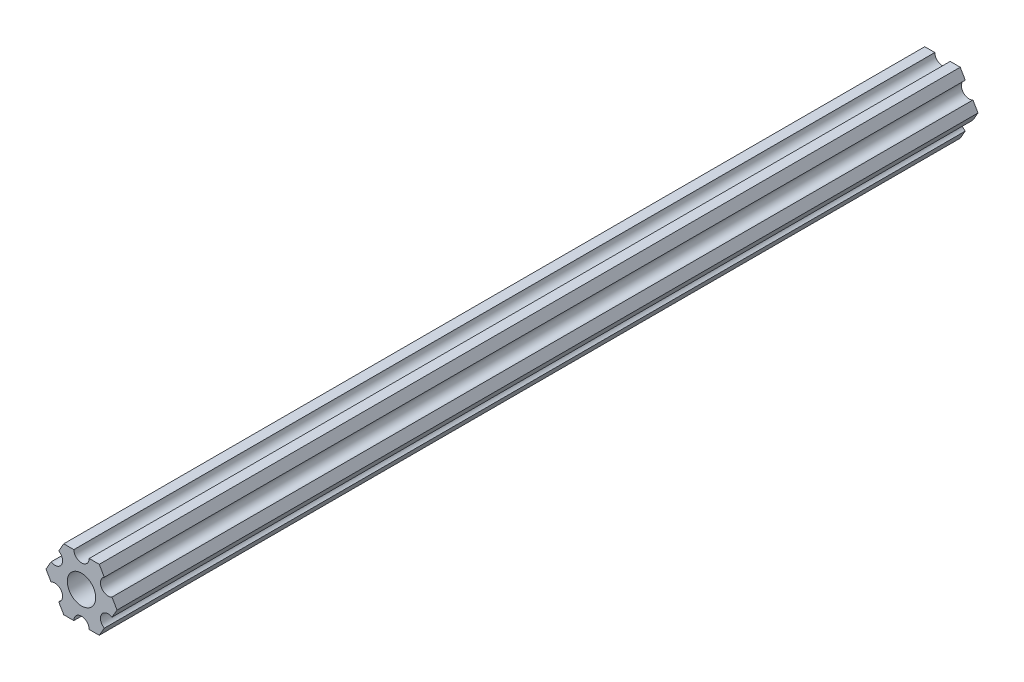
ISO-10303-21;
HEADER;
FILE_DESCRIPTION(('STEP AP214'),'2;1');
FILE_NAME('part.step','',(''),(''),'','','');
FILE_SCHEMA(('AUTOMOTIVE_DESIGN { 1 0 10303 214 1 1 1 1 }'));
ENDSEC;
DATA;
#1=APPLICATION_CONTEXT('core data for automotive mechanical design processes');
#2=APPLICATION_PROTOCOL_DEFINITION('international standard','automotive_design',2000,#1);
#3=PRODUCT_CONTEXT('',#1,'mechanical');
#4=PRODUCT('Part','Part','',(#3));
#5=PRODUCT_RELATED_PRODUCT_CATEGORY('part','',(#4));
#6=PRODUCT_DEFINITION_FORMATION('','',#4);
#7=PRODUCT_DEFINITION_CONTEXT('part definition',#1,'design');
#8=PRODUCT_DEFINITION('design','',#6,#7);
#9=PRODUCT_DEFINITION_SHAPE('','',#8);
#10=(LENGTH_UNIT() NAMED_UNIT(*) SI_UNIT(.MILLI.,.METRE.));
#11=(NAMED_UNIT(*) PLANE_ANGLE_UNIT() SI_UNIT($,.RADIAN.));
#12=(NAMED_UNIT(*) SI_UNIT($,.STERADIAN.) SOLID_ANGLE_UNIT());
#13=UNCERTAINTY_MEASURE_WITH_UNIT(LENGTH_MEASURE(1.E-05),#10,'distance_accuracy_value','');
#14=(GEOMETRIC_REPRESENTATION_CONTEXT(3) GLOBAL_UNCERTAINTY_ASSIGNED_CONTEXT((#13)) GLOBAL_UNIT_ASSIGNED_CONTEXT((#10,
#11,#12)) REPRESENTATION_CONTEXT('',''));
#15=CARTESIAN_POINT('',(0.,0.,0.));
#16=DIRECTION('',(0.,0.,1.));
#17=DIRECTION('',(1.,0.,0.));
#18=AXIS2_PLACEMENT_3D('',#15,#16,#17);
#19=CARTESIAN_POINT('',(5.49926131403118,3.175,177.8));
#20=DIRECTION('',(0.,0.,1.));
#21=DIRECTION('',(1.,0.,0.));
#22=AXIS2_PLACEMENT_3D('',#19,#20,#21);
#23=PLANE('',#22);
#24=DIRECTION('',(0.499999999999995,0.866025403784441,0.));
#25=VECTOR('',#24,1.);
#26=CARTESIAN_POINT('',(6.29301131403117,-1.8001846714922,177.8));
#27=LINE('',#26,#25);
#28=CARTESIAN_POINT('',(6.29301131403117,-1.8001846714922,177.8));
#29=VERTEX_POINT('',#28);
#30=CARTESIAN_POINT('',(7.33234841870821,0.,177.8));
#31=VERTEX_POINT('',#30);
#32=EDGE_CURVE('E231',#29,#31,#27,.T.);
#33=ORIENTED_EDGE('',*,*,#32,.T.);
#34=DIRECTION('',(-0.500000000000001,0.866025403784438,0.));
#35=VECTOR('',#34,1.);
#36=CARTESIAN_POINT('',(7.33234841870821,0.,177.8));
#37=LINE('',#36,#35);
#38=CARTESIAN_POINT('',(6.29301131403114,1.80018467149222,177.8));
#39=VERTEX_POINT('',#38);
#40=EDGE_CURVE('E129',#31,#39,#37,.T.);
#41=ORIENTED_EDGE('',*,*,#40,.T.);
#42=CARTESIAN_POINT('',(5.49926131403118,3.175,177.8));
#43=DIRECTION('',(0.,0.,-1.));
#44=DIRECTION('',(1.,0.,0.));
#45=AXIS2_PLACEMENT_3D('',#42,#43,#44);
#46=CIRCLE('',#45,1.58749999999997);
#47=CARTESIAN_POINT('',(4.70551131403117,4.54981532850775,177.8));
#48=VERTEX_POINT('',#47);
#49=EDGE_CURVE('E276',#39,#48,#46,.T.);
#50=ORIENTED_EDGE('',*,*,#49,.T.);
#51=DIRECTION('',(-0.500000000000001,0.866025403784438,0.));
#52=VECTOR('',#51,1.);
#53=CARTESIAN_POINT('',(4.70551131403117,4.54981532850775,177.8));
#54=LINE('',#53,#52);
#55=CARTESIAN_POINT('',(3.66617420935409,6.34999999999998,177.8));
#56=VERTEX_POINT('',#55);
#57=EDGE_CURVE('E295',#48,#56,#54,.T.);
#58=ORIENTED_EDGE('',*,*,#57,.T.);
#59=DIRECTION('',(-1.,0.,0.));
#60=VECTOR('',#59,1.);
#61=CARTESIAN_POINT('',(3.66617420935409,6.34999999999998,177.8));
#62=LINE('',#61,#60);
#63=CARTESIAN_POINT('',(1.58749999999997,6.34999999999997,177.8));
#64=VERTEX_POINT('',#63);
#65=EDGE_CURVE('E292',#56,#64,#62,.T.);
#66=ORIENTED_EDGE('',*,*,#65,.T.);
#67=CARTESIAN_POINT('',(0.,6.35,177.8));
#68=DIRECTION('',(0.,0.,-1.));
#69=DIRECTION('',(1.,0.,0.));
#70=AXIS2_PLACEMENT_3D('',#67,#68,#69);
#71=CIRCLE('',#70,1.5875);
#72=CARTESIAN_POINT('',(-1.5875,6.34999999999996,177.8));
#73=VERTEX_POINT('',#72);
#74=EDGE_CURVE('E294',#64,#73,#71,.T.);
#75=ORIENTED_EDGE('',*,*,#74,.T.);
#76=DIRECTION('',(-1.,0.,0.));
#77=VECTOR('',#76,1.);
#78=CARTESIAN_POINT('',(-1.58750000000003,6.34999999999996,177.8));
#79=LINE('',#78,#77);
#80=CARTESIAN_POINT('',(-3.66617420935413,6.34999999999995,177.8));
#81=VERTEX_POINT('',#80);
#82=EDGE_CURVE('E297',#73,#81,#79,.T.);
#83=ORIENTED_EDGE('',*,*,#82,.T.);
#84=DIRECTION('',(-0.499999999999995,-0.866025403784442,0.));
#85=VECTOR('',#84,1.);
#86=CARTESIAN_POINT('',(-3.66617420935413,6.34999999999995,177.8));
#87=LINE('',#86,#85);
#88=CARTESIAN_POINT('',(-4.70551131403113,4.54981532850783,177.8));
#89=VERTEX_POINT('',#88);
#90=EDGE_CURVE('E303',#81,#89,#87,.T.);
#91=ORIENTED_EDGE('',*,*,#90,.T.);
#92=CARTESIAN_POINT('',(-5.49926131403119,3.175,177.8));
#93=DIRECTION('',(0.,0.,-1.));
#94=DIRECTION('',(1.,0.,0.));
#95=AXIS2_PLACEMENT_3D('',#92,#93,#94);
#96=CIRCLE('',#95,1.5875);
#97=CARTESIAN_POINT('',(-6.29301131403115,1.80018467149218,177.8));
#98=VERTEX_POINT('',#97);
#99=EDGE_CURVE('E305',#89,#98,#96,.T.);
#100=ORIENTED_EDGE('',*,*,#99,.T.);
#101=DIRECTION('',(-0.499999999999995,-0.866025403784442,0.));
#102=VECTOR('',#101,1.);
#103=CARTESIAN_POINT('',(-6.29301131403112,1.80018467149222,177.8));
#104=LINE('',#103,#102);
#105=CARTESIAN_POINT('',(-7.33234841870821,0.,177.8));
#106=VERTEX_POINT('',#105);
#107=EDGE_CURVE('E307',#98,#106,#104,.T.);
#108=ORIENTED_EDGE('',*,*,#107,.T.);
#109=DIRECTION('',(0.500000000000007,-0.866025403784435,0.));
#110=VECTOR('',#109,1.);
#111=CARTESIAN_POINT('',(-7.33234841870821,0.,177.8));
#112=LINE('',#111,#110);
#113=CARTESIAN_POINT('',(-6.29301131403118,-1.80018467149216,177.8));
#114=VERTEX_POINT('',#113);
#115=EDGE_CURVE('E309',#106,#114,#112,.T.);
#116=ORIENTED_EDGE('',*,*,#115,.T.);
#117=CARTESIAN_POINT('',(-5.49926131403118,-3.175,177.8));
#118=DIRECTION('',(0.,0.,-1.));
#119=DIRECTION('',(1.,0.,0.));
#120=AXIS2_PLACEMENT_3D('',#117,#118,#119);
#121=CIRCLE('',#120,1.5875);
#122=CARTESIAN_POINT('',(-4.70551131403114,-4.54981532850777,177.8));
#123=VERTEX_POINT('',#122);
#124=EDGE_CURVE('E311',#114,#123,#121,.T.);
#125=ORIENTED_EDGE('',*,*,#124,.T.);
#126=DIRECTION('',(0.500000000000007,-0.866025403784435,0.));
#127=VECTOR('',#126,1.);
#128=CARTESIAN_POINT('',(-4.70551131403116,-4.54981532850774,177.8));
#129=LINE('',#128,#127);
#130=CARTESIAN_POINT('',(-3.66617420935405,-6.35,177.8));
#131=VERTEX_POINT('',#130);
#132=EDGE_CURVE('E313',#123,#131,#129,.T.);
#133=ORIENTED_EDGE('',*,*,#132,.T.);
#134=DIRECTION('',(1.,0.,0.));
#135=VECTOR('',#134,1.);
#136=CARTESIAN_POINT('',(-3.66617420935405,-6.35,177.8));
#137=LINE('',#136,#135);
#138=CARTESIAN_POINT('',(-1.58750000000002,-6.34999999999998,177.8));
#139=VERTEX_POINT('',#138);
#140=EDGE_CURVE('E315',#131,#139,#137,.T.);
#141=ORIENTED_EDGE('',*,*,#140,.T.);
#142=CARTESIAN_POINT('',(0.,-6.34999999999996,177.8));
#143=DIRECTION('',(0.,0.,-1.));
#144=DIRECTION('',(1.,0.,0.));
#145=AXIS2_PLACEMENT_3D('',#142,#143,#144);
#146=CIRCLE('',#145,1.5875);
#147=CARTESIAN_POINT('',(1.58749999999998,-6.34999999999995,177.8));
#148=VERTEX_POINT('',#147);
#149=EDGE_CURVE('E178',#139,#148,#146,.T.);
#150=ORIENTED_EDGE('',*,*,#149,.T.);
#151=DIRECTION('',(1.,0.,0.));
#152=VECTOR('',#151,1.);
#153=CARTESIAN_POINT('',(1.58749999999998,-6.34999999999995,177.8));
#154=LINE('',#153,#152);
#155=CARTESIAN_POINT('',(3.66617420935418,-6.34999999999992,177.8));
#156=VERTEX_POINT('',#155);
#157=EDGE_CURVE('E172',#148,#156,#154,.T.);
#158=ORIENTED_EDGE('',*,*,#157,.T.);
#159=DIRECTION('',(0.499999999999995,0.866025403784442,0.));
#160=VECTOR('',#159,1.);
#161=CARTESIAN_POINT('',(3.66617420935418,-6.34999999999992,177.8));
#162=LINE('',#161,#160);
#163=CARTESIAN_POINT('',(4.70551131403118,-4.5498153285078,177.8));
#164=VERTEX_POINT('',#163);
#165=EDGE_CURVE('E176',#156,#164,#162,.T.);
#166=ORIENTED_EDGE('',*,*,#165,.T.);
#167=CARTESIAN_POINT('',(5.49926131403115,-3.17499999999999,177.8));
#168=DIRECTION('',(0.,0.,-1.));
#169=DIRECTION('',(1.,0.,0.));
#170=AXIS2_PLACEMENT_3D('',#167,#168,#169);
#171=CIRCLE('',#170,1.5875);
#172=EDGE_CURVE('E56',#164,#29,#171,.T.);
#173=ORIENTED_EDGE('',*,*,#172,.T.);
#174=EDGE_LOOP('',(#33,#41,#50,#58,#66,#75,#83,#91,#100,#108,#116,#125,#133,#141,#150,#158,#166,#173));
#175=FACE_BOUND('',#174,.T.);
#176=CARTESIAN_POINT('',(0.,0.,177.8));
#177=DIRECTION('',(0.,0.,1.));
#178=DIRECTION('',(1.,0.,0.));
#179=AXIS2_PLACEMENT_3D('',#176,#177,#178);
#180=CIRCLE('',#179,2.9337);
#181=CARTESIAN_POINT('',(2.9337,0.,177.8));
#182=VERTEX_POINT('',#181);
#183=EDGE_CURVE('E200',#182,#182,#180,.T.);
#184=ORIENTED_EDGE('',*,*,#183,.F.);
#185=EDGE_LOOP('',(#184));
#186=FACE_BOUND('',#185,.T.);
#187=ADVANCED_FACE('F39',(#175,#186),#23,.T.);
#188=CARTESIAN_POINT('',(5.49926131403118,3.175,0.));
#189=DIRECTION('',(0.,0.,1.));
#190=DIRECTION('',(1.,0.,0.));
#191=AXIS2_PLACEMENT_3D('',#188,#189,#190);
#192=PLANE('',#191);
#193=DIRECTION('',(0.499999999999995,0.866025403784441,0.));
#194=VECTOR('',#193,1.);
#195=CARTESIAN_POINT('',(6.29301131403117,-1.8001846714922,0.));
#196=LINE('',#195,#194);
#197=CARTESIAN_POINT('',(6.29301131403117,-1.8001846714922,0.));
#198=VERTEX_POINT('',#197);
#199=CARTESIAN_POINT('',(7.33234841870821,0.,0.));
#200=VERTEX_POINT('',#199);
#201=EDGE_CURVE('E196',#198,#200,#196,.T.);
#202=ORIENTED_EDGE('',*,*,#201,.F.);
#203=CARTESIAN_POINT('',(5.49926131403115,-3.17499999999999,0.));
#204=DIRECTION('',(0.,0.,-1.));
#205=DIRECTION('',(1.,0.,0.));
#206=AXIS2_PLACEMENT_3D('',#203,#204,#205);
#207=CIRCLE('',#206,1.5875);
#208=CARTESIAN_POINT('',(4.70551131403118,-4.5498153285078,0.));
#209=VERTEX_POINT('',#208);
#210=EDGE_CURVE('E121',#209,#198,#207,.T.);
#211=ORIENTED_EDGE('',*,*,#210,.F.);
#212=DIRECTION('',(0.499999999999995,0.866025403784442,0.));
#213=VECTOR('',#212,1.);
#214=CARTESIAN_POINT('',(3.66617420935418,-6.34999999999992,0.));
#215=LINE('',#214,#213);
#216=CARTESIAN_POINT('',(3.66617420935418,-6.34999999999992,0.));
#217=VERTEX_POINT('',#216);
#218=EDGE_CURVE('E115',#217,#209,#215,.T.);
#219=ORIENTED_EDGE('',*,*,#218,.F.);
#220=DIRECTION('',(1.,0.,0.));
#221=VECTOR('',#220,1.);
#222=CARTESIAN_POINT('',(1.58749999999998,-6.34999999999995,0.));
#223=LINE('',#222,#221);
#224=CARTESIAN_POINT('',(1.58749999999998,-6.34999999999995,0.));
#225=VERTEX_POINT('',#224);
#226=EDGE_CURVE('E186',#225,#217,#223,.T.);
#227=ORIENTED_EDGE('',*,*,#226,.F.);
#228=CARTESIAN_POINT('',(0.,-6.34999999999996,0.));
#229=DIRECTION('',(0.,0.,-1.));
#230=DIRECTION('',(1.,0.,0.));
#231=AXIS2_PLACEMENT_3D('',#228,#229,#230);
#232=CIRCLE('',#231,1.5875);
#233=CARTESIAN_POINT('',(-1.58750000000002,-6.34999999999998,0.));
#234=VERTEX_POINT('',#233);
#235=EDGE_CURVE('E226',#234,#225,#232,.T.);
#236=ORIENTED_EDGE('',*,*,#235,.F.);
#237=DIRECTION('',(1.,0.,0.));
#238=VECTOR('',#237,1.);
#239=CARTESIAN_POINT('',(-3.66617420935405,-6.35,0.));
#240=LINE('',#239,#238);
#241=CARTESIAN_POINT('',(-3.66617420935405,-6.35,0.));
#242=VERTEX_POINT('',#241);
#243=EDGE_CURVE('E224',#242,#234,#240,.T.);
#244=ORIENTED_EDGE('',*,*,#243,.F.);
#245=DIRECTION('',(0.500000000000007,-0.866025403784435,0.));
#246=VECTOR('',#245,1.);
#247=CARTESIAN_POINT('',(-4.70551131403116,-4.54981532850774,0.));
#248=LINE('',#247,#246);
#249=CARTESIAN_POINT('',(-4.70551131403114,-4.54981532850777,0.));
#250=VERTEX_POINT('',#249);
#251=EDGE_CURVE('E222',#250,#242,#248,.T.);
#252=ORIENTED_EDGE('',*,*,#251,.F.);
#253=CARTESIAN_POINT('',(-5.49926131403118,-3.175,0.));
#254=DIRECTION('',(0.,0.,-1.));
#255=DIRECTION('',(1.,0.,0.));
#256=AXIS2_PLACEMENT_3D('',#253,#254,#255);
#257=CIRCLE('',#256,1.5875);
#258=CARTESIAN_POINT('',(-6.29301131403118,-1.80018467149216,0.));
#259=VERTEX_POINT('',#258);
#260=EDGE_CURVE('E220',#259,#250,#257,.T.);
#261=ORIENTED_EDGE('',*,*,#260,.F.);
#262=DIRECTION('',(0.500000000000007,-0.866025403784435,0.));
#263=VECTOR('',#262,1.);
#264=CARTESIAN_POINT('',(-7.33234841870821,0.,0.));
#265=LINE('',#264,#263);
#266=CARTESIAN_POINT('',(-7.33234841870821,0.,0.));
#267=VERTEX_POINT('',#266);
#268=EDGE_CURVE('E218',#267,#259,#265,.T.);
#269=ORIENTED_EDGE('',*,*,#268,.F.);
#270=DIRECTION('',(-0.499999999999995,-0.866025403784442,0.));
#271=VECTOR('',#270,1.);
#272=CARTESIAN_POINT('',(-6.29301131403112,1.80018467149222,0.));
#273=LINE('',#272,#271);
#274=CARTESIAN_POINT('',(-6.29301131403115,1.80018467149218,0.));
#275=VERTEX_POINT('',#274);
#276=EDGE_CURVE('E216',#275,#267,#273,.T.);
#277=ORIENTED_EDGE('',*,*,#276,.F.);
#278=CARTESIAN_POINT('',(-5.49926131403119,3.175,0.));
#279=DIRECTION('',(0.,0.,-1.));
#280=DIRECTION('',(1.,0.,0.));
#281=AXIS2_PLACEMENT_3D('',#278,#279,#280);
#282=CIRCLE('',#281,1.5875);
#283=CARTESIAN_POINT('',(-4.70551131403113,4.54981532850783,0.));
#284=VERTEX_POINT('',#283);
#285=EDGE_CURVE('E214',#284,#275,#282,.T.);
#286=ORIENTED_EDGE('',*,*,#285,.F.);
#287=DIRECTION('',(-0.499999999999995,-0.866025403784442,0.));
#288=VECTOR('',#287,1.);
#289=CARTESIAN_POINT('',(-3.66617420935413,6.34999999999995,0.));
#290=LINE('',#289,#288);
#291=CARTESIAN_POINT('',(-3.66617420935413,6.34999999999995,0.));
#292=VERTEX_POINT('',#291);
#293=EDGE_CURVE('E212',#292,#284,#290,.T.);
#294=ORIENTED_EDGE('',*,*,#293,.F.);
#295=DIRECTION('',(-1.,0.,0.));
#296=VECTOR('',#295,1.);
#297=CARTESIAN_POINT('',(-1.58750000000003,6.34999999999996,0.));
#298=LINE('',#297,#296);
#299=CARTESIAN_POINT('',(-1.5875,6.34999999999996,0.));
#300=VERTEX_POINT('',#299);
#301=EDGE_CURVE('E210',#300,#292,#298,.T.);
#302=ORIENTED_EDGE('',*,*,#301,.F.);
#303=CARTESIAN_POINT('',(0.,6.35,0.));
#304=DIRECTION('',(0.,0.,-1.));
#305=DIRECTION('',(1.,0.,0.));
#306=AXIS2_PLACEMENT_3D('',#303,#304,#305);
#307=CIRCLE('',#306,1.5875);
#308=CARTESIAN_POINT('',(1.58749999999997,6.34999999999997,0.));
#309=VERTEX_POINT('',#308);
#310=EDGE_CURVE('E208',#309,#300,#307,.T.);
#311=ORIENTED_EDGE('',*,*,#310,.F.);
#312=DIRECTION('',(-1.,0.,0.));
#313=VECTOR('',#312,1.);
#314=CARTESIAN_POINT('',(3.66617420935409,6.34999999999998,0.));
#315=LINE('',#314,#313);
#316=CARTESIAN_POINT('',(3.66617420935409,6.34999999999998,0.));
#317=VERTEX_POINT('',#316);
#318=EDGE_CURVE('E206',#317,#309,#315,.T.);
#319=ORIENTED_EDGE('',*,*,#318,.F.);
#320=DIRECTION('',(-0.500000000000001,0.866025403784438,0.));
#321=VECTOR('',#320,1.);
#322=CARTESIAN_POINT('',(4.70551131403117,4.54981532850775,0.));
#323=LINE('',#322,#321);
#324=CARTESIAN_POINT('',(4.70551131403117,4.54981532850775,0.));
#325=VERTEX_POINT('',#324);
#326=EDGE_CURVE('E204',#325,#317,#323,.T.);
#327=ORIENTED_EDGE('',*,*,#326,.F.);
#328=CARTESIAN_POINT('',(5.49926131403118,3.175,0.));
#329=DIRECTION('',(0.,0.,-1.));
#330=DIRECTION('',(1.,0.,0.));
#331=AXIS2_PLACEMENT_3D('',#328,#329,#330);
#332=CIRCLE('',#331,1.58749999999997);
#333=CARTESIAN_POINT('',(6.29301131403114,1.80018467149222,0.));
#334=VERTEX_POINT('',#333);
#335=EDGE_CURVE('E202',#334,#325,#332,.T.);
#336=ORIENTED_EDGE('',*,*,#335,.F.);
#337=DIRECTION('',(-0.500000000000001,0.866025403784438,0.));
#338=VECTOR('',#337,1.);
#339=CARTESIAN_POINT('',(7.33234841870821,0.,0.));
#340=LINE('',#339,#338);
#341=EDGE_CURVE('E199',#200,#334,#340,.T.);
#342=ORIENTED_EDGE('',*,*,#341,.F.);
#343=EDGE_LOOP('',(#202,#211,#219,#227,#236,#244,#252,#261,#269,#277,#286,#294,#302,#311,#319,
#327,#336,#342));
#344=FACE_BOUND('',#343,.T.);
#345=CARTESIAN_POINT('',(0.,0.,0.));
#346=DIRECTION('',(0.,0.,1.));
#347=DIRECTION('',(1.,0.,0.));
#348=AXIS2_PLACEMENT_3D('',#345,#346,#347);
#349=CIRCLE('',#348,2.9337);
#350=CARTESIAN_POINT('',(2.9337,0.,0.));
#351=VERTEX_POINT('',#350);
#352=EDGE_CURVE('E540',#351,#351,#349,.T.);
#353=ORIENTED_EDGE('',*,*,#352,.T.);
#354=EDGE_LOOP('',(#353));
#355=FACE_BOUND('',#354,.T.);
#356=ADVANCED_FACE('F280',(#344,#355),#192,.F.);
#357=CARTESIAN_POINT('',(6.29301131403117,-1.8001846714922,177.8));
#358=DIRECTION('',(-0.866025403784441,0.499999999999995,0.));
#359=DIRECTION('',(-0.499999999999995,-0.866025403784442,0.));
#360=AXIS2_PLACEMENT_3D('',#357,#358,#359);
#361=PLANE('',#360);
#362=ORIENTED_EDGE('',*,*,#201,.T.);
#363=DIRECTION('',(0.,0.,-1.));
#364=VECTOR('',#363,1.);
#365=CARTESIAN_POINT('',(7.33234841870821,0.,177.8));
#366=LINE('',#365,#364);
#367=EDGE_CURVE('E11',#31,#200,#366,.T.);
#368=ORIENTED_EDGE('',*,*,#367,.F.);
#369=ORIENTED_EDGE('',*,*,#32,.F.);
#370=DIRECTION('',(0.,0.,-1.));
#371=VECTOR('',#370,1.);
#372=CARTESIAN_POINT('',(6.29301131403117,-1.8001846714922,177.8));
#373=LINE('',#372,#371);
#374=EDGE_CURVE('E192',#29,#198,#373,.T.);
#375=ORIENTED_EDGE('',*,*,#374,.T.);
#376=EDGE_LOOP('',(#362,#368,#369,#375));
#377=FACE_BOUND('',#376,.T.);
#378=ADVANCED_FACE('F41',(#377),#361,.F.);
#379=CARTESIAN_POINT('',(7.33234841870821,0.,177.8));
#380=DIRECTION('',(-0.866025403784438,-0.500000000000001,0.));
#381=DIRECTION('',(0.500000000000001,-0.866025403784438,0.));
#382=AXIS2_PLACEMENT_3D('',#379,#380,#381);
#383=PLANE('',#382);
#384=ORIENTED_EDGE('',*,*,#341,.T.);
#385=DIRECTION('',(0.,0.,-1.));
#386=VECTOR('',#385,1.);
#387=CARTESIAN_POINT('',(6.29301131403114,1.80018467149222,177.8));
#388=LINE('',#387,#386);
#389=EDGE_CURVE('E48',#39,#334,#388,.T.);
#390=ORIENTED_EDGE('',*,*,#389,.F.);
#391=ORIENTED_EDGE('',*,*,#40,.F.);
#392=ORIENTED_EDGE('',*,*,#367,.T.);
#393=EDGE_LOOP('',(#384,#390,#391,#392));
#394=FACE_BOUND('',#393,.T.);
#395=ADVANCED_FACE('F349',(#394),#383,.F.);
#396=CARTESIAN_POINT('',(5.49926131403118,3.175,177.8));
#397=DIRECTION('',(0.,0.,-1.));
#398=DIRECTION('',(-1.,0.,0.));
#399=AXIS2_PLACEMENT_3D('',#396,#397,#398);
#400=CYLINDRICAL_SURFACE('',#399,1.58749999999997);
#401=ORIENTED_EDGE('',*,*,#335,.T.);
#402=DIRECTION('',(0.,0.,-1.));
#403=VECTOR('',#402,1.);
#404=CARTESIAN_POINT('',(4.70551131403117,4.54981532850775,177.8));
#405=LINE('',#404,#403);
#406=EDGE_CURVE('E268',#48,#325,#405,.T.);
#407=ORIENTED_EDGE('',*,*,#406,.F.);
#408=ORIENTED_EDGE('',*,*,#49,.F.);
#409=ORIENTED_EDGE('',*,*,#389,.T.);
#410=EDGE_LOOP('',(#401,#407,#408,#409));
#411=FACE_BOUND('',#410,.T.);
#412=ADVANCED_FACE('F274',(#411),#400,.F.);
#413=CARTESIAN_POINT('',(4.70551131403117,4.54981532850775,177.8));
#414=DIRECTION('',(-0.866025403784438,-0.500000000000001,0.));
#415=DIRECTION('',(0.500000000000001,-0.866025403784438,0.));
#416=AXIS2_PLACEMENT_3D('',#413,#414,#415);
#417=PLANE('',#416);
#418=ORIENTED_EDGE('',*,*,#326,.T.);
#419=DIRECTION('',(0.,0.,-1.));
#420=VECTOR('',#419,1.);
#421=CARTESIAN_POINT('',(3.66617420935409,6.34999999999998,177.8));
#422=LINE('',#421,#420);
#423=EDGE_CURVE('E265',#56,#317,#422,.T.);
#424=ORIENTED_EDGE('',*,*,#423,.F.);
#425=ORIENTED_EDGE('',*,*,#57,.F.);
#426=ORIENTED_EDGE('',*,*,#406,.T.);
#427=EDGE_LOOP('',(#418,#424,#425,#426));
#428=FACE_BOUND('',#427,.T.);
#429=ADVANCED_FACE('F286',(#428),#417,.F.);
#430=CARTESIAN_POINT('',(3.66617420935409,6.34999999999998,177.8));
#431=DIRECTION('',(0.,-1.,0.));
#432=DIRECTION('',(1.,0.,0.));
#433=AXIS2_PLACEMENT_3D('',#430,#431,#432);
#434=PLANE('',#433);
#435=ORIENTED_EDGE('',*,*,#318,.T.);
#436=DIRECTION('',(0.,0.,-1.));
#437=VECTOR('',#436,1.);
#438=CARTESIAN_POINT('',(1.58749999999997,6.34999999999997,177.8));
#439=LINE('',#438,#437);
#440=EDGE_CURVE('E262',#64,#309,#439,.T.);
#441=ORIENTED_EDGE('',*,*,#440,.F.);
#442=ORIENTED_EDGE('',*,*,#65,.F.);
#443=ORIENTED_EDGE('',*,*,#423,.T.);
#444=EDGE_LOOP('',(#435,#441,#442,#443));
#445=FACE_BOUND('',#444,.T.);
#446=ADVANCED_FACE('F290',(#445),#434,.F.);
#447=CARTESIAN_POINT('',(0.,6.35,177.8));
#448=DIRECTION('',(0.,0.,-1.));
#449=DIRECTION('',(-1.,0.,0.));
#450=AXIS2_PLACEMENT_3D('',#447,#448,#449);
#451=CYLINDRICAL_SURFACE('',#450,1.5875);
#452=ORIENTED_EDGE('',*,*,#310,.T.);
#453=DIRECTION('',(0.,0.,-1.));
#454=VECTOR('',#453,1.);
#455=CARTESIAN_POINT('',(-1.5875,6.34999999999996,177.8));
#456=LINE('',#455,#454);
#457=EDGE_CURVE('E259',#73,#300,#456,.T.);
#458=ORIENTED_EDGE('',*,*,#457,.F.);
#459=ORIENTED_EDGE('',*,*,#74,.F.);
#460=ORIENTED_EDGE('',*,*,#440,.T.);
#461=EDGE_LOOP('',(#452,#458,#459,#460));
#462=FACE_BOUND('',#461,.T.);
#463=ADVANCED_FACE('F362',(#462),#451,.F.);
#464=CARTESIAN_POINT('',(-1.58750000000003,6.34999999999996,177.8));
#465=DIRECTION('',(0.,-1.,0.));
#466=DIRECTION('',(1.,0.,0.));
#467=AXIS2_PLACEMENT_3D('',#464,#465,#466);
#468=PLANE('',#467);
#469=ORIENTED_EDGE('',*,*,#301,.T.);
#470=DIRECTION('',(0.,0.,-1.));
#471=VECTOR('',#470,1.);
#472=CARTESIAN_POINT('',(-3.66617420935413,6.34999999999995,177.8));
#473=LINE('',#472,#471);
#474=EDGE_CURVE('E256',#81,#292,#473,.T.);
#475=ORIENTED_EDGE('',*,*,#474,.F.);
#476=ORIENTED_EDGE('',*,*,#82,.F.);
#477=ORIENTED_EDGE('',*,*,#457,.T.);
#478=EDGE_LOOP('',(#469,#475,#476,#477));
#479=FACE_BOUND('',#478,.T.);
#480=ADVANCED_FACE('F365',(#479),#468,.F.);
#481=CARTESIAN_POINT('',(-3.66617420935413,6.34999999999995,177.8));
#482=DIRECTION('',(0.866025403784442,-0.499999999999995,0.));
#483=DIRECTION('',(0.499999999999995,0.866025403784442,0.));
#484=AXIS2_PLACEMENT_3D('',#481,#482,#483);
#485=PLANE('',#484);
#486=ORIENTED_EDGE('',*,*,#293,.T.);
#487=DIRECTION('',(0.,0.,-1.));
#488=VECTOR('',#487,1.);
#489=CARTESIAN_POINT('',(-4.70551131403113,4.54981532850783,177.8));
#490=LINE('',#489,#488);
#491=EDGE_CURVE('E253',#89,#284,#490,.T.);
#492=ORIENTED_EDGE('',*,*,#491,.F.);
#493=ORIENTED_EDGE('',*,*,#90,.F.);
#494=ORIENTED_EDGE('',*,*,#474,.T.);
#495=EDGE_LOOP('',(#486,#492,#493,#494));
#496=FACE_BOUND('',#495,.T.);
#497=ADVANCED_FACE('F369',(#496),#485,.F.);
#498=CARTESIAN_POINT('',(-5.49926131403119,3.175,177.8));
#499=DIRECTION('',(0.,0.,-1.));
#500=DIRECTION('',(-1.,0.,0.));
#501=AXIS2_PLACEMENT_3D('',#498,#499,#500);
#502=CYLINDRICAL_SURFACE('',#501,1.5875);
#503=ORIENTED_EDGE('',*,*,#285,.T.);
#504=DIRECTION('',(0.,0.,-1.));
#505=VECTOR('',#504,1.);
#506=CARTESIAN_POINT('',(-6.29301131403115,1.80018467149218,177.8));
#507=LINE('',#506,#505);
#508=EDGE_CURVE('E250',#98,#275,#507,.T.);
#509=ORIENTED_EDGE('',*,*,#508,.F.);
#510=ORIENTED_EDGE('',*,*,#99,.F.);
#511=ORIENTED_EDGE('',*,*,#491,.T.);
#512=EDGE_LOOP('',(#503,#509,#510,#511));
#513=FACE_BOUND('',#512,.T.);
#514=ADVANCED_FACE('F373',(#513),#502,.F.);
#515=CARTESIAN_POINT('',(-6.29301131403112,1.80018467149222,177.8));
#516=DIRECTION('',(0.866025403784441,-0.499999999999995,0.));
#517=DIRECTION('',(0.499999999999995,0.866025403784442,0.));
#518=AXIS2_PLACEMENT_3D('',#515,#516,#517);
#519=PLANE('',#518);
#520=ORIENTED_EDGE('',*,*,#276,.T.);
#521=DIRECTION('',(0.,0.,-1.));
#522=VECTOR('',#521,1.);
#523=CARTESIAN_POINT('',(-7.33234841870821,0.,177.8));
#524=LINE('',#523,#522);
#525=EDGE_CURVE('E247',#106,#267,#524,.T.);
#526=ORIENTED_EDGE('',*,*,#525,.F.);
#527=ORIENTED_EDGE('',*,*,#107,.F.);
#528=ORIENTED_EDGE('',*,*,#508,.T.);
#529=EDGE_LOOP('',(#520,#526,#527,#528));
#530=FACE_BOUND('',#529,.T.);
#531=ADVANCED_FACE('F377',(#530),#519,.F.);
#532=CARTESIAN_POINT('',(-7.33234841870821,0.,177.8));
#533=DIRECTION('',(0.866025403784435,0.500000000000007,0.));
#534=DIRECTION('',(-0.500000000000007,0.866025403784435,0.));
#535=AXIS2_PLACEMENT_3D('',#532,#533,#534);
#536=PLANE('',#535);
#537=ORIENTED_EDGE('',*,*,#268,.T.);
#538=DIRECTION('',(0.,0.,-1.));
#539=VECTOR('',#538,1.);
#540=CARTESIAN_POINT('',(-6.29301131403118,-1.80018467149216,177.8));
#541=LINE('',#540,#539);
#542=EDGE_CURVE('E244',#114,#259,#541,.T.);
#543=ORIENTED_EDGE('',*,*,#542,.F.);
#544=ORIENTED_EDGE('',*,*,#115,.F.);
#545=ORIENTED_EDGE('',*,*,#525,.T.);
#546=EDGE_LOOP('',(#537,#543,#544,#545));
#547=FACE_BOUND('',#546,.T.);
#548=ADVANCED_FACE('F381',(#547),#536,.F.);
#549=CARTESIAN_POINT('',(-5.49926131403118,-3.175,177.8));
#550=DIRECTION('',(0.,0.,-1.));
#551=DIRECTION('',(-1.,0.,0.));
#552=AXIS2_PLACEMENT_3D('',#549,#550,#551);
#553=CYLINDRICAL_SURFACE('',#552,1.5875);
#554=ORIENTED_EDGE('',*,*,#260,.T.);
#555=DIRECTION('',(0.,0.,-1.));
#556=VECTOR('',#555,1.);
#557=CARTESIAN_POINT('',(-4.70551131403114,-4.54981532850777,177.8));
#558=LINE('',#557,#556);
#559=EDGE_CURVE('E241',#123,#250,#558,.T.);
#560=ORIENTED_EDGE('',*,*,#559,.F.);
#561=ORIENTED_EDGE('',*,*,#124,.F.);
#562=ORIENTED_EDGE('',*,*,#542,.T.);
#563=EDGE_LOOP('',(#554,#560,#561,#562));
#564=FACE_BOUND('',#563,.T.);
#565=ADVANCED_FACE('F385',(#564),#553,.F.);
#566=CARTESIAN_POINT('',(-4.70551131403116,-4.54981532850774,177.8));
#567=DIRECTION('',(0.866025403784434,0.500000000000007,0.));
#568=DIRECTION('',(-0.500000000000007,0.866025403784435,0.));
#569=AXIS2_PLACEMENT_3D('',#566,#567,#568);
#570=PLANE('',#569);
#571=ORIENTED_EDGE('',*,*,#251,.T.);
#572=DIRECTION('',(0.,0.,-1.));
#573=VECTOR('',#572,1.);
#574=CARTESIAN_POINT('',(-3.66617420935405,-6.35,177.8));
#575=LINE('',#574,#573);
#576=EDGE_CURVE('E238',#131,#242,#575,.T.);
#577=ORIENTED_EDGE('',*,*,#576,.F.);
#578=ORIENTED_EDGE('',*,*,#132,.F.);
#579=ORIENTED_EDGE('',*,*,#559,.T.);
#580=EDGE_LOOP('',(#571,#577,#578,#579));
#581=FACE_BOUND('',#580,.T.);
#582=ADVANCED_FACE('F389',(#581),#570,.F.);
#583=CARTESIAN_POINT('',(-3.66617420935405,-6.35,177.8));
#584=DIRECTION('',(0.,1.,0.));
#585=DIRECTION('',(-1.,0.,0.));
#586=AXIS2_PLACEMENT_3D('',#583,#584,#585);
#587=PLANE('',#586);
#588=ORIENTED_EDGE('',*,*,#243,.T.);
#589=DIRECTION('',(0.,0.,-1.));
#590=VECTOR('',#589,1.);
#591=CARTESIAN_POINT('',(-1.58750000000002,-6.34999999999998,177.8));
#592=LINE('',#591,#590);
#593=EDGE_CURVE('E235',#139,#234,#592,.T.);
#594=ORIENTED_EDGE('',*,*,#593,.F.);
#595=ORIENTED_EDGE('',*,*,#140,.F.);
#596=ORIENTED_EDGE('',*,*,#576,.T.);
#597=EDGE_LOOP('',(#588,#594,#595,#596));
#598=FACE_BOUND('',#597,.T.);
#599=ADVANCED_FACE('F321',(#598),#587,.F.);
#600=CARTESIAN_POINT('',(0.,-6.34999999999996,177.8));
#601=DIRECTION('',(0.,0.,-1.));
#602=DIRECTION('',(-1.,0.,0.));
#603=AXIS2_PLACEMENT_3D('',#600,#601,#602);
#604=CYLINDRICAL_SURFACE('',#603,1.5875);
#605=ORIENTED_EDGE('',*,*,#235,.T.);
#606=DIRECTION('',(0.,0.,-1.));
#607=VECTOR('',#606,1.);
#608=CARTESIAN_POINT('',(1.58749999999998,-6.34999999999995,177.8));
#609=LINE('',#608,#607);
#610=EDGE_CURVE('E187',#148,#225,#609,.T.);
#611=ORIENTED_EDGE('',*,*,#610,.F.);
#612=ORIENTED_EDGE('',*,*,#149,.F.);
#613=ORIENTED_EDGE('',*,*,#593,.T.);
#614=EDGE_LOOP('',(#605,#611,#612,#613));
#615=FACE_BOUND('',#614,.T.);
#616=ADVANCED_FACE('F325',(#615),#604,.F.);
#617=CARTESIAN_POINT('',(1.58749999999998,-6.34999999999995,177.8));
#618=DIRECTION('',(0.,1.,0.));
#619=DIRECTION('',(-1.,0.,0.));
#620=AXIS2_PLACEMENT_3D('',#617,#618,#619);
#621=PLANE('',#620);
#622=ORIENTED_EDGE('',*,*,#226,.T.);
#623=DIRECTION('',(0.,0.,-1.));
#624=VECTOR('',#623,1.);
#625=CARTESIAN_POINT('',(3.66617420935418,-6.34999999999992,177.8));
#626=LINE('',#625,#624);
#627=EDGE_CURVE('E183',#156,#217,#626,.T.);
#628=ORIENTED_EDGE('',*,*,#627,.F.);
#629=ORIENTED_EDGE('',*,*,#157,.F.);
#630=ORIENTED_EDGE('',*,*,#610,.T.);
#631=EDGE_LOOP('',(#622,#628,#629,#630));
#632=FACE_BOUND('',#631,.T.);
#633=ADVANCED_FACE('F184',(#632),#621,.F.);
#634=CARTESIAN_POINT('',(3.66617420935418,-6.34999999999992,177.8));
#635=DIRECTION('',(-0.866025403784441,0.499999999999995,0.));
#636=DIRECTION('',(-0.499999999999995,-0.866025403784442,0.));
#637=AXIS2_PLACEMENT_3D('',#634,#635,#636);
#638=PLANE('',#637);
#639=ORIENTED_EDGE('',*,*,#218,.T.);
#640=DIRECTION('',(0.,0.,-1.));
#641=VECTOR('',#640,1.);
#642=CARTESIAN_POINT('',(4.70551131403118,-4.5498153285078,177.8));
#643=LINE('',#642,#641);
#644=EDGE_CURVE('E188',#164,#209,#643,.T.);
#645=ORIENTED_EDGE('',*,*,#644,.F.);
#646=ORIENTED_EDGE('',*,*,#165,.F.);
#647=ORIENTED_EDGE('',*,*,#627,.T.);
#648=EDGE_LOOP('',(#639,#645,#646,#647));
#649=FACE_BOUND('',#648,.T.);
#650=ADVANCED_FACE('F190',(#649),#638,.F.);
#651=CARTESIAN_POINT('',(5.49926131403115,-3.17499999999999,177.8));
#652=DIRECTION('',(0.,0.,-1.));
#653=DIRECTION('',(-1.,0.,0.));
#654=AXIS2_PLACEMENT_3D('',#651,#652,#653);
#655=CYLINDRICAL_SURFACE('',#654,1.5875);
#656=ORIENTED_EDGE('',*,*,#210,.T.);
#657=ORIENTED_EDGE('',*,*,#374,.F.);
#658=ORIENTED_EDGE('',*,*,#172,.F.);
#659=ORIENTED_EDGE('',*,*,#644,.T.);
#660=EDGE_LOOP('',(#656,#657,#658,#659));
#661=FACE_BOUND('',#660,.T.);
#662=ADVANCED_FACE('F329',(#661),#655,.F.);
#663=CARTESIAN_POINT('',(0.,0.,177.8));
#664=DIRECTION('',(0.,0.,-1.));
#665=DIRECTION('',(-1.,0.,0.));
#666=AXIS2_PLACEMENT_3D('',#663,#664,#665);
#667=CYLINDRICAL_SURFACE('',#666,2.9337);
#668=ORIENTED_EDGE('',*,*,#183,.T.);
#669=EDGE_LOOP('',(#668));
#670=FACE_BOUND('',#669,.T.);
#671=ORIENTED_EDGE('',*,*,#352,.F.);
#672=EDGE_LOOP('',(#671));
#673=FACE_BOUND('',#672,.T.);
#674=ADVANCED_FACE('F331',(#670,#673),#667,.F.);
#675=CLOSED_SHELL('',(#187,#356,#378,#395,#412,#429,#446,#463,#480,#497,#514,#531,#548,#565,
#582,#599,#616,#633,#650,#662,#674));
#676=MANIFOLD_SOLID_BREP('B2',#675);
#677=ADVANCED_BREP_SHAPE_REPRESENTATION('',(#18,#676),#14);
#678=SHAPE_DEFINITION_REPRESENTATION(#9,#677);
ENDSEC;
END-ISO-10303-21;
